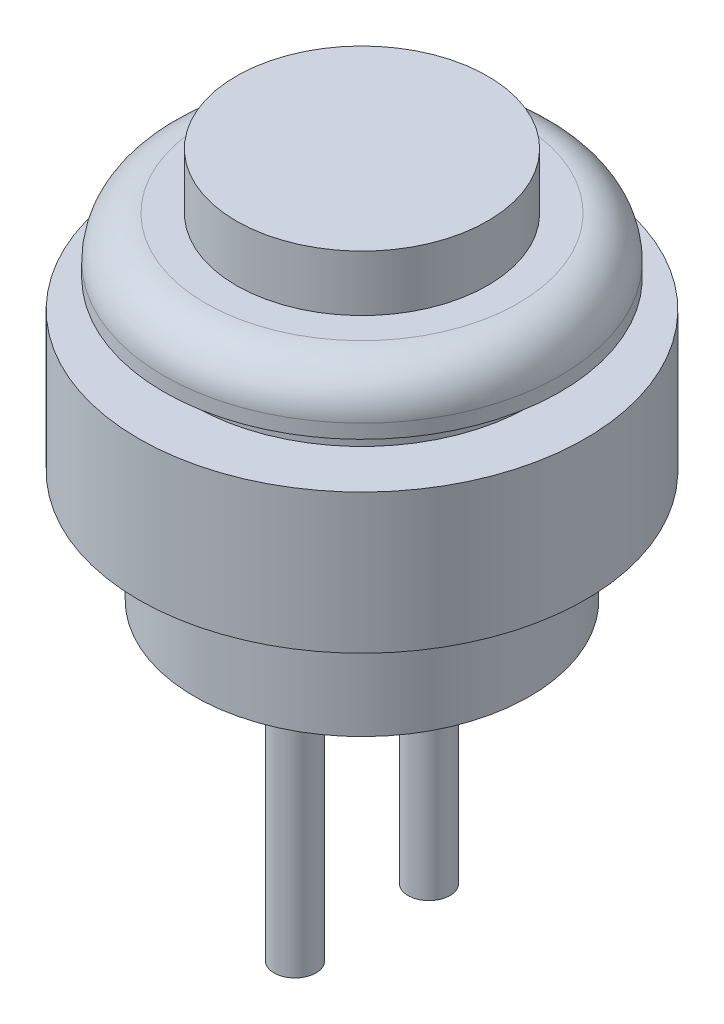
ISO-10303-21;
HEADER;
FILE_DESCRIPTION(('STEP AP214'),'2;1');
FILE_NAME('part.step','',(''),(''),'','','');
FILE_SCHEMA(('AUTOMOTIVE_DESIGN { 1 0 10303 214 1 1 1 1 }'));
ENDSEC;
DATA;
#1=APPLICATION_CONTEXT('core data for automotive mechanical design processes');
#2=APPLICATION_PROTOCOL_DEFINITION('international standard','automotive_design',2000,#1);
#3=PRODUCT_CONTEXT('',#1,'mechanical');
#4=PRODUCT('Part','Part','',(#3));
#5=PRODUCT_RELATED_PRODUCT_CATEGORY('part','',(#4));
#6=PRODUCT_DEFINITION_FORMATION('','',#4);
#7=PRODUCT_DEFINITION_CONTEXT('part definition',#1,'design');
#8=PRODUCT_DEFINITION('design','',#6,#7);
#9=PRODUCT_DEFINITION_SHAPE('','',#8);
#10=(LENGTH_UNIT() NAMED_UNIT(*) SI_UNIT(.MILLI.,.METRE.));
#11=(NAMED_UNIT(*) PLANE_ANGLE_UNIT() SI_UNIT($,.RADIAN.));
#12=(NAMED_UNIT(*) SI_UNIT($,.STERADIAN.) SOLID_ANGLE_UNIT());
#13=UNCERTAINTY_MEASURE_WITH_UNIT(LENGTH_MEASURE(1.E-05),#10,'distance_accuracy_value','');
#14=(GEOMETRIC_REPRESENTATION_CONTEXT(3) GLOBAL_UNCERTAINTY_ASSIGNED_CONTEXT((#13)) GLOBAL_UNIT_ASSIGNED_CONTEXT((#10,
#11,#12)) REPRESENTATION_CONTEXT('',''));
#15=CARTESIAN_POINT('',(0.,0.,0.));
#16=DIRECTION('',(0.,0.,1.));
#17=DIRECTION('',(1.,0.,0.));
#18=AXIS2_PLACEMENT_3D('',#15,#16,#17);
#19=CARTESIAN_POINT('',(0.,-10.,0.));
#20=DIRECTION('',(0.,1.,0.));
#21=DIRECTION('',(0.,0.,1.));
#22=AXIS2_PLACEMENT_3D('',#19,#20,#21);
#23=CYLINDRICAL_SURFACE('',#22,6.);
#24=CARTESIAN_POINT('',(0.,0.,0.));
#25=DIRECTION('',(0.,1.,0.));
#26=DIRECTION('',(0.,0.,1.));
#27=AXIS2_PLACEMENT_3D('',#24,#25,#26);
#28=CIRCLE('',#27,6.);
#29=CARTESIAN_POINT('',(0.,0.,6.));
#30=VERTEX_POINT('',#29);
#31=EDGE_CURVE('E37',#30,#30,#28,.F.);
#32=ORIENTED_EDGE('',*,*,#31,.T.);
#33=EDGE_LOOP('',(#32));
#34=FACE_BOUND('',#33,.T.);
#35=CARTESIAN_POINT('',(0.,-0.999999999999999,0.));
#36=DIRECTION('',(0.,-1.,0.));
#37=DIRECTION('',(0.,0.,-1.));
#38=AXIS2_PLACEMENT_3D('',#35,#36,#37);
#39=CIRCLE('',#38,6.);
#40=CARTESIAN_POINT('',(0.,-0.999999999999999,-6.));
#41=VERTEX_POINT('',#40);
#42=EDGE_CURVE('E10',#41,#41,#39,.T.);
#43=ORIENTED_EDGE('',*,*,#42,.F.);
#44=EDGE_LOOP('',(#43));
#45=FACE_BOUND('',#44,.T.);
#46=ADVANCED_FACE('F30',(#34,#45),#23,.T.);
#47=CARTESIAN_POINT('',(0.,0.,0.));
#48=DIRECTION('',(0.,1.,0.));
#49=DIRECTION('',(0.,0.,1.));
#50=AXIS2_PLACEMENT_3D('',#47,#48,#49);
#51=PLANE('',#50);
#52=CARTESIAN_POINT('',(0.,0.,0.));
#53=DIRECTION('',(0.,1.,0.));
#54=DIRECTION('',(0.,0.,1.));
#55=AXIS2_PLACEMENT_3D('',#52,#53,#54);
#56=CIRCLE('',#55,7.1);
#57=CARTESIAN_POINT('',(0.,0.,7.1));
#58=VERTEX_POINT('',#57);
#59=EDGE_CURVE('E50',#58,#58,#56,.T.);
#60=ORIENTED_EDGE('',*,*,#59,.F.);
#61=EDGE_LOOP('',(#60));
#62=FACE_BOUND('',#61,.T.);
#63=ORIENTED_EDGE('',*,*,#31,.F.);
#64=EDGE_LOOP('',(#63));
#65=FACE_BOUND('',#64,.T.);
#66=ADVANCED_FACE('F105',(#62,#65),#51,.F.);
#67=CARTESIAN_POINT('',(0.,2.,0.));
#68=DIRECTION('',(0.,1.,0.));
#69=DIRECTION('',(0.,0.,1.));
#70=AXIS2_PLACEMENT_3D('',#67,#68,#69);
#71=PLANE('',#70);
#72=CARTESIAN_POINT('',(0.,2.,0.));
#73=DIRECTION('',(0.,1.,0.));
#74=DIRECTION('',(0.,0.,1.));
#75=AXIS2_PLACEMENT_3D('',#72,#73,#74);
#76=CIRCLE('',#75,5.6);
#77=CARTESIAN_POINT('',(0.,2.,5.6));
#78=VERTEX_POINT('',#77);
#79=EDGE_CURVE('E45',#78,#78,#76,.T.);
#80=ORIENTED_EDGE('',*,*,#79,.T.);
#81=EDGE_LOOP('',(#80));
#82=FACE_BOUND('',#81,.T.);
#83=CARTESIAN_POINT('',(0.,2.,0.));
#84=DIRECTION('',(0.,1.,0.));
#85=DIRECTION('',(0.,0.,1.));
#86=AXIS2_PLACEMENT_3D('',#83,#84,#85);
#87=CIRCLE('',#86,4.5);
#88=CARTESIAN_POINT('',(0.,2.,4.5));
#89=VERTEX_POINT('',#88);
#90=EDGE_CURVE('E56',#89,#89,#87,.T.);
#91=ORIENTED_EDGE('',*,*,#90,.F.);
#92=EDGE_LOOP('',(#91));
#93=FACE_BOUND('',#92,.T.);
#94=ADVANCED_FACE('F110',(#82,#93),#71,.T.);
#95=CARTESIAN_POINT('',(0.,2.,0.));
#96=DIRECTION('',(0.,-1.,0.));
#97=DIRECTION('',(0.,0.,-1.));
#98=AXIS2_PLACEMENT_3D('',#95,#96,#97);
#99=CYLINDRICAL_SURFACE('',#98,7.1);
#100=CARTESIAN_POINT('',(0.,0.5,0.));
#101=DIRECTION('',(0.,1.,0.));
#102=DIRECTION('',(0.,0.,1.));
#103=AXIS2_PLACEMENT_3D('',#100,#101,#102);
#104=CIRCLE('',#103,7.1);
#105=CARTESIAN_POINT('',(0.,0.5,7.1));
#106=VERTEX_POINT('',#105);
#107=EDGE_CURVE('E41',#106,#106,#104,.F.);
#108=ORIENTED_EDGE('',*,*,#107,.T.);
#109=EDGE_LOOP('',(#108));
#110=FACE_BOUND('',#109,.T.);
#111=ORIENTED_EDGE('',*,*,#59,.T.);
#112=EDGE_LOOP('',(#111));
#113=FACE_BOUND('',#112,.T.);
#114=ADVANCED_FACE('F32',(#110,#113),#99,.T.);
#115=CARTESIAN_POINT('',(0.,0.5,0.));
#116=DIRECTION('',(0.,1.,0.));
#117=DIRECTION('',(0.,0.,1.));
#118=AXIS2_PLACEMENT_3D('',#115,#116,#117);
#119=TOROIDAL_SURFACE('',#118,5.6,1.5);
#120=ORIENTED_EDGE('',*,*,#107,.F.);
#121=EDGE_LOOP('',(#120));
#122=FACE_BOUND('',#121,.T.);
#123=ORIENTED_EDGE('',*,*,#79,.F.);
#124=EDGE_LOOP('',(#123));
#125=FACE_BOUND('',#124,.T.);
#126=ADVANCED_FACE('F193',(#122,#125),#119,.T.);
#127=CARTESIAN_POINT('',(0.,4.,0.));
#128=DIRECTION('',(0.,-1.,0.));
#129=DIRECTION('',(0.,0.,-1.));
#130=AXIS2_PLACEMENT_3D('',#127,#128,#129);
#131=CYLINDRICAL_SURFACE('',#130,4.5);
#132=CARTESIAN_POINT('',(0.,4.,0.));
#133=DIRECTION('',(0.,1.,0.));
#134=DIRECTION('',(0.,0.,1.));
#135=AXIS2_PLACEMENT_3D('',#132,#133,#134);
#136=CIRCLE('',#135,4.5);
#137=CARTESIAN_POINT('',(0.,4.,4.5));
#138=VERTEX_POINT('',#137);
#139=EDGE_CURVE('E53',#138,#138,#136,.T.);
#140=ORIENTED_EDGE('',*,*,#139,.F.);
#141=EDGE_LOOP('',(#140));
#142=FACE_BOUND('',#141,.T.);
#143=ORIENTED_EDGE('',*,*,#90,.T.);
#144=EDGE_LOOP('',(#143));
#145=FACE_BOUND('',#144,.T.);
#146=ADVANCED_FACE('F100',(#142,#145),#131,.T.);
#147=CARTESIAN_POINT('',(0.,4.,0.));
#148=DIRECTION('',(0.,1.,0.));
#149=DIRECTION('',(0.,0.,1.));
#150=AXIS2_PLACEMENT_3D('',#147,#148,#149);
#151=PLANE('',#150);
#152=ORIENTED_EDGE('',*,*,#139,.T.);
#153=EDGE_LOOP('',(#152));
#154=FACE_BOUND('',#153,.T.);
#155=ADVANCED_FACE('F90',(#154),#151,.T.);
#156=CARTESIAN_POINT('',(0.,-6.,0.));
#157=DIRECTION('',(0.,-1.,0.));
#158=DIRECTION('',(0.,0.,-1.));
#159=AXIS2_PLACEMENT_3D('',#156,#157,#158);
#160=PLANE('',#159);
#161=CARTESIAN_POINT('',(0.,-6.,0.));
#162=DIRECTION('',(0.,-1.,0.));
#163=DIRECTION('',(0.,0.,-1.));
#164=AXIS2_PLACEMENT_3D('',#161,#162,#163);
#165=CIRCLE('',#164,8.);
#166=CARTESIAN_POINT('',(0.,-6.,-8.));
#167=VERTEX_POINT('',#166);
#168=EDGE_CURVE('E74',#167,#167,#165,.T.);
#169=ORIENTED_EDGE('',*,*,#168,.T.);
#170=EDGE_LOOP('',(#169));
#171=FACE_BOUND('',#170,.T.);
#172=CARTESIAN_POINT('',(0.,-6.,0.));
#173=DIRECTION('',(0.,-1.,0.));
#174=DIRECTION('',(0.,0.,-1.));
#175=AXIS2_PLACEMENT_3D('',#172,#173,#174);
#176=CIRCLE('',#175,6.);
#177=CARTESIAN_POINT('',(0.,-6.,-6.));
#178=VERTEX_POINT('',#177);
#179=EDGE_CURVE('E80',#178,#178,#176,.T.);
#180=ORIENTED_EDGE('',*,*,#179,.F.);
#181=EDGE_LOOP('',(#180));
#182=FACE_BOUND('',#181,.T.);
#183=ADVANCED_FACE('F87',(#171,#182),#160,.T.);
#184=CARTESIAN_POINT('',(0.,-1.,0.));
#185=DIRECTION('',(0.,-1.,0.));
#186=DIRECTION('',(0.,0.,-1.));
#187=AXIS2_PLACEMENT_3D('',#184,#185,#186);
#188=PLANE('',#187);
#189=CARTESIAN_POINT('',(0.,-1.,0.));
#190=DIRECTION('',(0.,-1.,0.));
#191=DIRECTION('',(0.,0.,-1.));
#192=AXIS2_PLACEMENT_3D('',#189,#190,#191);
#193=CIRCLE('',#192,8.);
#194=CARTESIAN_POINT('',(0.,-1.,-8.));
#195=VERTEX_POINT('',#194);
#196=EDGE_CURVE('E77',#195,#195,#193,.T.);
#197=ORIENTED_EDGE('',*,*,#196,.F.);
#198=EDGE_LOOP('',(#197));
#199=FACE_BOUND('',#198,.T.);
#200=ORIENTED_EDGE('',*,*,#42,.T.);
#201=EDGE_LOOP('',(#200));
#202=FACE_BOUND('',#201,.T.);
#203=ADVANCED_FACE('F89',(#199,#202),#188,.F.);
#204=CARTESIAN_POINT('',(0.,-6.,0.));
#205=DIRECTION('',(0.,1.,0.));
#206=DIRECTION('',(0.,0.,1.));
#207=AXIS2_PLACEMENT_3D('',#204,#205,#206);
#208=CYLINDRICAL_SURFACE('',#207,8.);
#209=ORIENTED_EDGE('',*,*,#168,.F.);
#210=EDGE_LOOP('',(#209));
#211=FACE_BOUND('',#210,.T.);
#212=ORIENTED_EDGE('',*,*,#196,.T.);
#213=EDGE_LOOP('',(#212));
#214=FACE_BOUND('',#213,.T.);
#215=ADVANCED_FACE('F97',(#211,#214),#208,.T.);
#216=CARTESIAN_POINT('',(0.,-20.,2.4));
#217=DIRECTION('',(0.,-1.,0.));
#218=DIRECTION('',(0.,0.,-1.));
#219=AXIS2_PLACEMENT_3D('',#216,#217,#218);
#220=PLANE('',#219);
#221=CARTESIAN_POINT('',(0.,-20.,2.4));
#222=DIRECTION('',(0.,-1.,0.));
#223=DIRECTION('',(0.,0.,-1.));
#224=AXIS2_PLACEMENT_3D('',#221,#222,#223);
#225=CIRCLE('',#224,0.75);
#226=CARTESIAN_POINT('',(0.,-20.,1.65));
#227=VERTEX_POINT('',#226);
#228=EDGE_CURVE('E68',#227,#227,#225,.T.);
#229=ORIENTED_EDGE('',*,*,#228,.T.);
#230=EDGE_LOOP('',(#229));
#231=FACE_BOUND('',#230,.T.);
#232=ADVANCED_FACE('F134',(#231),#220,.T.);
#233=CARTESIAN_POINT('',(0.,-20.,-2.4));
#234=DIRECTION('',(0.,-1.,0.));
#235=DIRECTION('',(0.,0.,-1.));
#236=AXIS2_PLACEMENT_3D('',#233,#234,#235);
#237=PLANE('',#236);
#238=CARTESIAN_POINT('',(0.,-20.,-2.4));
#239=DIRECTION('',(0.,-1.,0.));
#240=DIRECTION('',(0.,0.,-1.));
#241=AXIS2_PLACEMENT_3D('',#238,#239,#240);
#242=CIRCLE('',#241,0.75);
#243=CARTESIAN_POINT('',(0.,-20.,-3.15));
#244=VERTEX_POINT('',#243);
#245=EDGE_CURVE('E62',#244,#244,#242,.T.);
#246=ORIENTED_EDGE('',*,*,#245,.T.);
#247=EDGE_LOOP('',(#246));
#248=FACE_BOUND('',#247,.T.);
#249=ADVANCED_FACE('F131',(#248),#237,.T.);
#250=CARTESIAN_POINT('',(0.,-20.,2.4));
#251=DIRECTION('',(0.,1.,0.));
#252=DIRECTION('',(0.,0.,1.));
#253=AXIS2_PLACEMENT_3D('',#250,#251,#252);
#254=CYLINDRICAL_SURFACE('',#253,0.75);
#255=ORIENTED_EDGE('',*,*,#228,.F.);
#256=EDGE_LOOP('',(#255));
#257=FACE_BOUND('',#256,.T.);
#258=CARTESIAN_POINT('',(0.,-10.,2.4));
#259=DIRECTION('',(0.,-1.,0.));
#260=DIRECTION('',(0.,0.,-1.));
#261=AXIS2_PLACEMENT_3D('',#258,#259,#260);
#262=CIRCLE('',#261,0.75);
#263=CARTESIAN_POINT('',(0.,-10.,1.65));
#264=VERTEX_POINT('',#263);
#265=EDGE_CURVE('E71',#264,#264,#262,.T.);
#266=ORIENTED_EDGE('',*,*,#265,.T.);
#267=EDGE_LOOP('',(#266));
#268=FACE_BOUND('',#267,.T.);
#269=ADVANCED_FACE('F125',(#257,#268),#254,.T.);
#270=CARTESIAN_POINT('',(0.,-20.,-2.4));
#271=DIRECTION('',(0.,1.,0.));
#272=DIRECTION('',(0.,0.,1.));
#273=AXIS2_PLACEMENT_3D('',#270,#271,#272);
#274=CYLINDRICAL_SURFACE('',#273,0.75);
#275=ORIENTED_EDGE('',*,*,#245,.F.);
#276=EDGE_LOOP('',(#275));
#277=FACE_BOUND('',#276,.T.);
#278=CARTESIAN_POINT('',(0.,-10.,-2.4));
#279=DIRECTION('',(0.,-1.,0.));
#280=DIRECTION('',(0.,0.,-1.));
#281=AXIS2_PLACEMENT_3D('',#278,#279,#280);
#282=CIRCLE('',#281,0.75);
#283=CARTESIAN_POINT('',(0.,-10.,-3.15));
#284=VERTEX_POINT('',#283);
#285=EDGE_CURVE('E65',#284,#284,#282,.T.);
#286=ORIENTED_EDGE('',*,*,#285,.T.);
#287=EDGE_LOOP('',(#286));
#288=FACE_BOUND('',#287,.T.);
#289=ADVANCED_FACE('F120',(#277,#288),#274,.T.);
#290=CARTESIAN_POINT('',(0.,-10.,0.));
#291=DIRECTION('',(0.,-1.,0.));
#292=DIRECTION('',(0.,0.,-1.));
#293=AXIS2_PLACEMENT_3D('',#290,#291,#292);
#294=PLANE('',#293);
#295=ORIENTED_EDGE('',*,*,#285,.F.);
#296=EDGE_LOOP('',(#295));
#297=FACE_BOUND('',#296,.T.);
#298=CARTESIAN_POINT('',(0.,-10.,0.));
#299=DIRECTION('',(0.,-1.,0.));
#300=DIRECTION('',(0.,0.,-1.));
#301=AXIS2_PLACEMENT_3D('',#298,#299,#300);
#302=CIRCLE('',#301,6.);
#303=CARTESIAN_POINT('',(0.,-10.,-6.));
#304=VERTEX_POINT('',#303);
#305=EDGE_CURVE('E59',#304,#304,#302,.T.);
#306=ORIENTED_EDGE('',*,*,#305,.T.);
#307=EDGE_LOOP('',(#306));
#308=FACE_BOUND('',#307,.T.);
#309=ORIENTED_EDGE('',*,*,#265,.F.);
#310=EDGE_LOOP('',(#309));
#311=FACE_BOUND('',#310,.T.);
#312=ADVANCED_FACE('F116',(#297,#308,#311),#294,.T.);
#313=ORIENTED_EDGE('',*,*,#179,.T.);
#314=EDGE_LOOP('',(#313));
#315=FACE_BOUND('',#314,.T.);
#316=ORIENTED_EDGE('',*,*,#305,.F.);
#317=EDGE_LOOP('',(#316));
#318=FACE_BOUND('',#317,.T.);
#319=ADVANCED_FACE('F84',(#315,#318),#23,.T.);
#320=CLOSED_SHELL('',(#46,#66,#94,#114,#126,#146,#155,#183,#203,#215,#232,#249,#269,#289,#312,#319));
#321=MANIFOLD_SOLID_BREP('B2',#320);
#322=ADVANCED_BREP_SHAPE_REPRESENTATION('',(#18,#321),#14);
#323=SHAPE_DEFINITION_REPRESENTATION(#9,#322);
ENDSEC;
END-ISO-10303-21;
